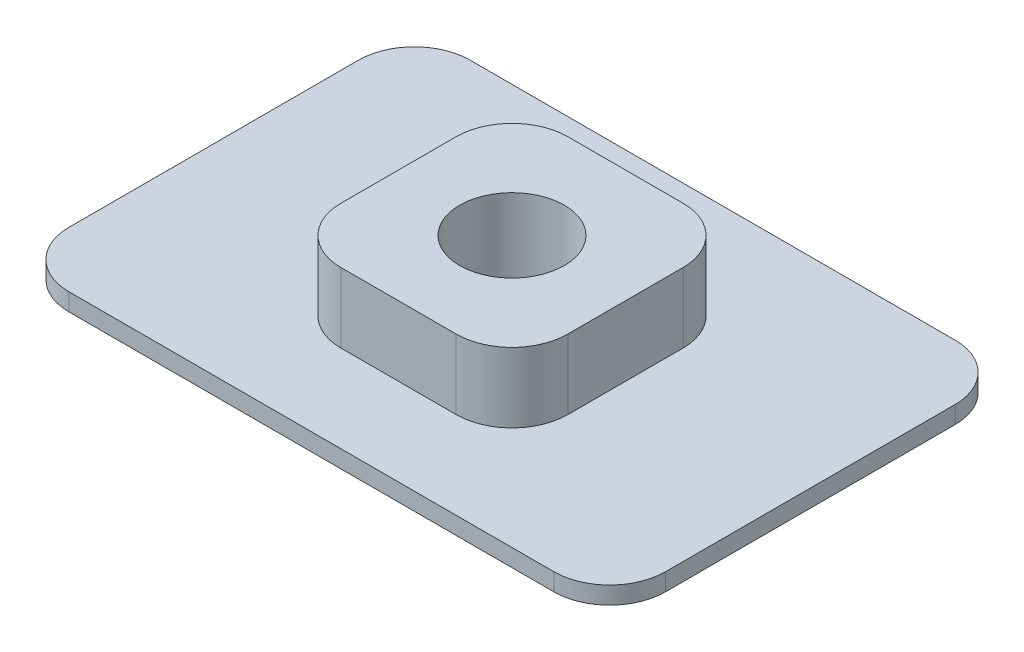
ISO-10303-21;
HEADER;
FILE_DESCRIPTION(('STEP AP214'),'2;1');
FILE_NAME('part.step','',(''),(''),'','','');
FILE_SCHEMA(('AUTOMOTIVE_DESIGN { 1 0 10303 214 1 1 1 1 }'));
ENDSEC;
DATA;
#1=APPLICATION_CONTEXT('core data for automotive mechanical design processes');
#2=APPLICATION_PROTOCOL_DEFINITION('international standard','automotive_design',2000,#1);
#3=PRODUCT_CONTEXT('',#1,'mechanical');
#4=PRODUCT('Part','Part','',(#3));
#5=PRODUCT_RELATED_PRODUCT_CATEGORY('part','',(#4));
#6=PRODUCT_DEFINITION_FORMATION('','',#4);
#7=PRODUCT_DEFINITION_CONTEXT('part definition',#1,'design');
#8=PRODUCT_DEFINITION('design','',#6,#7);
#9=PRODUCT_DEFINITION_SHAPE('','',#8);
#10=(LENGTH_UNIT() NAMED_UNIT(*) SI_UNIT(.MILLI.,.METRE.));
#11=(NAMED_UNIT(*) PLANE_ANGLE_UNIT() SI_UNIT($,.RADIAN.));
#12=(NAMED_UNIT(*) SI_UNIT($,.STERADIAN.) SOLID_ANGLE_UNIT());
#13=UNCERTAINTY_MEASURE_WITH_UNIT(LENGTH_MEASURE(1.E-05),#10,'distance_accuracy_value','');
#14=(GEOMETRIC_REPRESENTATION_CONTEXT(3) GLOBAL_UNCERTAINTY_ASSIGNED_CONTEXT((#13)) GLOBAL_UNIT_ASSIGNED_CONTEXT((#10,
#11,#12)) REPRESENTATION_CONTEXT('',''));
#15=CARTESIAN_POINT('',(0.,0.,0.));
#16=DIRECTION('',(0.,0.,1.));
#17=DIRECTION('',(1.,0.,0.));
#18=AXIS2_PLACEMENT_3D('',#15,#16,#17);
#19=CARTESIAN_POINT('',(0.,2.5,0.));
#20=DIRECTION('',(0.,-1.,0.));
#21=DIRECTION('',(0.,0.,-1.));
#22=AXIS2_PLACEMENT_3D('',#19,#20,#21);
#23=PLANE('',#22);
#24=DIRECTION('',(-1.,0.,0.));
#25=VECTOR('',#24,1.);
#26=CARTESIAN_POINT('',(-42.75,2.5,-28.75));
#27=LINE('',#26,#25);
#28=CARTESIAN_POINT('',(34.75,2.5,-28.75));
#29=VERTEX_POINT('',#28);
#30=CARTESIAN_POINT('',(-34.75,2.5,-28.75));
#31=VERTEX_POINT('',#30);
#32=EDGE_CURVE('E284',#29,#31,#27,.T.);
#33=ORIENTED_EDGE('',*,*,#32,.T.);
#34=CARTESIAN_POINT('',(-34.75,2.5,-20.75));
#35=DIRECTION('',(0.,-1.,0.));
#36=DIRECTION('',(0.,0.,-1.));
#37=AXIS2_PLACEMENT_3D('',#34,#35,#36);
#38=CIRCLE('',#37,8.);
#39=CARTESIAN_POINT('',(-42.75,2.5,-20.75));
#40=VERTEX_POINT('',#39);
#41=EDGE_CURVE('E217',#31,#40,#38,.F.);
#42=ORIENTED_EDGE('',*,*,#41,.T.);
#43=DIRECTION('',(0.,0.,1.));
#44=VECTOR('',#43,1.);
#45=CARTESIAN_POINT('',(-42.75,2.5,28.75));
#46=LINE('',#45,#44);
#47=CARTESIAN_POINT('',(-42.75,2.5,20.75));
#48=VERTEX_POINT('',#47);
#49=EDGE_CURVE('E173',#40,#48,#46,.T.);
#50=ORIENTED_EDGE('',*,*,#49,.T.);
#51=CARTESIAN_POINT('',(-34.75,2.5,20.75));
#52=DIRECTION('',(0.,-1.,0.));
#53=DIRECTION('',(0.,0.,-1.));
#54=AXIS2_PLACEMENT_3D('',#51,#52,#53);
#55=CIRCLE('',#54,8.);
#56=CARTESIAN_POINT('',(-34.75,2.5,28.75));
#57=VERTEX_POINT('',#56);
#58=EDGE_CURVE('E208',#48,#57,#55,.F.);
#59=ORIENTED_EDGE('',*,*,#58,.T.);
#60=DIRECTION('',(1.,0.,0.));
#61=VECTOR('',#60,1.);
#62=CARTESIAN_POINT('',(-42.75,2.5,28.75));
#63=LINE('',#62,#61);
#64=CARTESIAN_POINT('',(34.75,2.5,28.75));
#65=VERTEX_POINT('',#64);
#66=EDGE_CURVE('E194',#57,#65,#63,.T.);
#67=ORIENTED_EDGE('',*,*,#66,.T.);
#68=CARTESIAN_POINT('',(34.75,2.5,20.75));
#69=DIRECTION('',(0.,-1.,0.));
#70=DIRECTION('',(0.,0.,-1.));
#71=AXIS2_PLACEMENT_3D('',#68,#69,#70);
#72=CIRCLE('',#71,8.);
#73=CARTESIAN_POINT('',(42.75,2.5,20.75));
#74=VERTEX_POINT('',#73);
#75=EDGE_CURVE('E211',#65,#74,#72,.F.);
#76=ORIENTED_EDGE('',*,*,#75,.T.);
#77=DIRECTION('',(0.,0.,-1.));
#78=VECTOR('',#77,1.);
#79=CARTESIAN_POINT('',(42.75,2.5,28.75));
#80=LINE('',#79,#78);
#81=CARTESIAN_POINT('',(42.75,2.5,-20.75));
#82=VERTEX_POINT('',#81);
#83=EDGE_CURVE('E187',#74,#82,#80,.T.);
#84=ORIENTED_EDGE('',*,*,#83,.T.);
#85=CARTESIAN_POINT('',(34.75,2.5,-20.75));
#86=DIRECTION('',(0.,-1.,0.));
#87=DIRECTION('',(0.,0.,-1.));
#88=AXIS2_PLACEMENT_3D('',#85,#86,#87);
#89=CIRCLE('',#88,8.);
#90=EDGE_CURVE('E214',#82,#29,#89,.F.);
#91=ORIENTED_EDGE('',*,*,#90,.T.);
#92=EDGE_LOOP('',(#33,#42,#50,#59,#67,#76,#84,#91));
#93=FACE_BOUND('',#92,.T.);
#94=DIRECTION('',(0.,0.,-1.));
#95=VECTOR('',#94,1.);
#96=CARTESIAN_POINT('',(16.25,2.5,16.25));
#97=LINE('',#96,#95);
#98=CARTESIAN_POINT('',(16.25,2.5,8.25));
#99=VERTEX_POINT('',#98);
#100=CARTESIAN_POINT('',(16.25,2.5,-8.25));
#101=VERTEX_POINT('',#100);
#102=EDGE_CURVE('E316',#99,#101,#97,.T.);
#103=ORIENTED_EDGE('',*,*,#102,.F.);
#104=CARTESIAN_POINT('',(8.24999999999999,2.5,8.25));
#105=DIRECTION('',(0.,-1.,0.));
#106=DIRECTION('',(0.,0.,-1.));
#107=AXIS2_PLACEMENT_3D('',#104,#105,#106);
#108=CIRCLE('',#107,8.);
#109=CARTESIAN_POINT('',(8.24999999999999,2.5,16.25));
#110=VERTEX_POINT('',#109);
#111=EDGE_CURVE('E48',#99,#110,#108,.T.);
#112=ORIENTED_EDGE('',*,*,#111,.T.);
#113=DIRECTION('',(1.,0.,0.));
#114=VECTOR('',#113,1.);
#115=CARTESIAN_POINT('',(-16.25,2.5,16.25));
#116=LINE('',#115,#114);
#117=CARTESIAN_POINT('',(-8.25000000000001,2.5,16.25));
#118=VERTEX_POINT('',#117);
#119=EDGE_CURVE('E295',#118,#110,#116,.T.);
#120=ORIENTED_EDGE('',*,*,#119,.F.);
#121=CARTESIAN_POINT('',(-8.25000000000001,2.5,8.25));
#122=DIRECTION('',(0.,-1.,0.));
#123=DIRECTION('',(0.,0.,-1.));
#124=AXIS2_PLACEMENT_3D('',#121,#122,#123);
#125=CIRCLE('',#124,8.);
#126=CARTESIAN_POINT('',(-16.25,2.5,8.25));
#127=VERTEX_POINT('',#126);
#128=EDGE_CURVE('E11',#118,#127,#125,.T.);
#129=ORIENTED_EDGE('',*,*,#128,.T.);
#130=DIRECTION('',(0.,0.,1.));
#131=VECTOR('',#130,1.);
#132=CARTESIAN_POINT('',(-16.25,2.5,16.25));
#133=LINE('',#132,#131);
#134=CARTESIAN_POINT('',(-16.25,2.5,-8.25));
#135=VERTEX_POINT('',#134);
#136=EDGE_CURVE('E324',#135,#127,#133,.T.);
#137=ORIENTED_EDGE('',*,*,#136,.F.);
#138=CARTESIAN_POINT('',(-8.25000000000001,2.5,-8.25));
#139=DIRECTION('',(0.,-1.,0.));
#140=DIRECTION('',(0.,0.,-1.));
#141=AXIS2_PLACEMENT_3D('',#138,#139,#140);
#142=CIRCLE('',#141,8.);
#143=CARTESIAN_POINT('',(-8.25000000000001,2.5,-16.25));
#144=VERTEX_POINT('',#143);
#145=EDGE_CURVE('E273',#135,#144,#142,.T.);
#146=ORIENTED_EDGE('',*,*,#145,.T.);
#147=DIRECTION('',(-1.,0.,0.));
#148=VECTOR('',#147,1.);
#149=CARTESIAN_POINT('',(-16.25,2.5,-16.25));
#150=LINE('',#149,#148);
#151=CARTESIAN_POINT('',(8.24999999999999,2.5,-16.25));
#152=VERTEX_POINT('',#151);
#153=EDGE_CURVE('E320',#152,#144,#150,.T.);
#154=ORIENTED_EDGE('',*,*,#153,.F.);
#155=CARTESIAN_POINT('',(8.24999999999999,2.5,-8.25));
#156=DIRECTION('',(0.,-1.,0.));
#157=DIRECTION('',(0.,0.,-1.));
#158=AXIS2_PLACEMENT_3D('',#155,#156,#157);
#159=CIRCLE('',#158,8.);
#160=EDGE_CURVE('E276',#152,#101,#159,.T.);
#161=ORIENTED_EDGE('',*,*,#160,.T.);
#162=EDGE_LOOP('',(#103,#112,#120,#129,#137,#146,#154,#161));
#163=FACE_BOUND('',#162,.T.);
#164=ADVANCED_FACE('F39',(#93,#163),#23,.F.);
#165=CARTESIAN_POINT('',(42.75,2.5,28.75));
#166=DIRECTION('',(-1.,0.,0.));
#167=DIRECTION('',(0.,0.,1.));
#168=AXIS2_PLACEMENT_3D('',#165,#166,#167);
#169=PLANE('',#168);
#170=DIRECTION('',(0.,0.,-1.));
#171=VECTOR('',#170,1.);
#172=CARTESIAN_POINT('',(42.75,0.,28.75));
#173=LINE('',#172,#171);
#174=CARTESIAN_POINT('',(42.75,0.,20.75));
#175=VERTEX_POINT('',#174);
#176=CARTESIAN_POINT('',(42.75,0.,-20.75));
#177=VERTEX_POINT('',#176);
#178=EDGE_CURVE('E189',#175,#177,#173,.T.);
#179=ORIENTED_EDGE('',*,*,#178,.T.);
#180=DIRECTION('',(0.,-1.,0.));
#181=VECTOR('',#180,1.);
#182=CARTESIAN_POINT('',(42.75,2.5,-20.75));
#183=LINE('',#182,#181);
#184=EDGE_CURVE('E224',#177,#82,#183,.F.);
#185=ORIENTED_EDGE('',*,*,#184,.T.);
#186=ORIENTED_EDGE('',*,*,#83,.F.);
#187=DIRECTION('',(0.,-1.,0.));
#188=VECTOR('',#187,1.);
#189=CARTESIAN_POINT('',(42.75,2.5,20.75));
#190=LINE('',#189,#188);
#191=EDGE_CURVE('E220',#74,#175,#190,.T.);
#192=ORIENTED_EDGE('',*,*,#191,.T.);
#193=EDGE_LOOP('',(#179,#185,#186,#192));
#194=FACE_BOUND('',#193,.T.);
#195=ADVANCED_FACE('F386',(#194),#169,.F.);
#196=CARTESIAN_POINT('',(-42.75,2.5,-28.75));
#197=DIRECTION('',(0.,0.,1.));
#198=DIRECTION('',(1.,0.,0.));
#199=AXIS2_PLACEMENT_3D('',#196,#197,#198);
#200=PLANE('',#199);
#201=DIRECTION('',(-1.,0.,0.));
#202=VECTOR('',#201,1.);
#203=CARTESIAN_POINT('',(-42.75,0.,-28.75));
#204=LINE('',#203,#202);
#205=CARTESIAN_POINT('',(34.75,0.,-28.75));
#206=VERTEX_POINT('',#205);
#207=CARTESIAN_POINT('',(-34.75,0.,-28.75));
#208=VERTEX_POINT('',#207);
#209=EDGE_CURVE('E182',#206,#208,#204,.T.);
#210=ORIENTED_EDGE('',*,*,#209,.T.);
#211=DIRECTION('',(0.,-1.,0.));
#212=VECTOR('',#211,1.);
#213=CARTESIAN_POINT('',(-34.75,2.5,-28.75));
#214=LINE('',#213,#212);
#215=EDGE_CURVE('E157',#208,#31,#214,.F.);
#216=ORIENTED_EDGE('',*,*,#215,.T.);
#217=ORIENTED_EDGE('',*,*,#32,.F.);
#218=DIRECTION('',(0.,-1.,0.));
#219=VECTOR('',#218,1.);
#220=CARTESIAN_POINT('',(34.75,2.5,-28.75));
#221=LINE('',#220,#219);
#222=EDGE_CURVE('E163',#29,#206,#221,.T.);
#223=ORIENTED_EDGE('',*,*,#222,.T.);
#224=EDGE_LOOP('',(#210,#216,#217,#223));
#225=FACE_BOUND('',#224,.T.);
#226=ADVANCED_FACE('F391',(#225),#200,.F.);
#227=CARTESIAN_POINT('',(-42.75,2.5,28.75));
#228=DIRECTION('',(1.,0.,0.));
#229=DIRECTION('',(0.,0.,-1.));
#230=AXIS2_PLACEMENT_3D('',#227,#228,#229);
#231=PLANE('',#230);
#232=ORIENTED_EDGE('',*,*,#49,.F.);
#233=DIRECTION('',(0.,-1.,0.));
#234=VECTOR('',#233,1.);
#235=CARTESIAN_POINT('',(-42.75,2.5,-20.75));
#236=LINE('',#235,#234);
#237=CARTESIAN_POINT('',(-42.75,0.,-20.75));
#238=VERTEX_POINT('',#237);
#239=EDGE_CURVE('E156',#40,#238,#236,.T.);
#240=ORIENTED_EDGE('',*,*,#239,.T.);
#241=DIRECTION('',(0.,0.,1.));
#242=VECTOR('',#241,1.);
#243=CARTESIAN_POINT('',(-42.75,0.,28.75));
#244=LINE('',#243,#242);
#245=CARTESIAN_POINT('',(-42.75,0.,20.75));
#246=VERTEX_POINT('',#245);
#247=EDGE_CURVE('E170',#238,#246,#244,.T.);
#248=ORIENTED_EDGE('',*,*,#247,.T.);
#249=DIRECTION('',(0.,-1.,0.));
#250=VECTOR('',#249,1.);
#251=CARTESIAN_POINT('',(-42.75,2.5,20.75));
#252=LINE('',#251,#250);
#253=EDGE_CURVE('E176',#246,#48,#252,.F.);
#254=ORIENTED_EDGE('',*,*,#253,.T.);
#255=EDGE_LOOP('',(#232,#240,#248,#254));
#256=FACE_BOUND('',#255,.T.);
#257=ADVANCED_FACE('F169',(#256),#231,.F.);
#258=CARTESIAN_POINT('',(-42.75,2.5,28.75));
#259=DIRECTION('',(0.,0.,-1.));
#260=DIRECTION('',(-1.,0.,0.));
#261=AXIS2_PLACEMENT_3D('',#258,#259,#260);
#262=PLANE('',#261);
#263=DIRECTION('',(1.,0.,0.));
#264=VECTOR('',#263,1.);
#265=CARTESIAN_POINT('',(-42.75,0.,28.75));
#266=LINE('',#265,#264);
#267=CARTESIAN_POINT('',(-34.75,0.,28.75));
#268=VERTEX_POINT('',#267);
#269=CARTESIAN_POINT('',(34.75,0.,28.75));
#270=VERTEX_POINT('',#269);
#271=EDGE_CURVE('E181',#268,#270,#266,.T.);
#272=ORIENTED_EDGE('',*,*,#271,.T.);
#273=DIRECTION('',(0.,-1.,0.));
#274=VECTOR('',#273,1.);
#275=CARTESIAN_POINT('',(34.75,2.5,28.75));
#276=LINE('',#275,#274);
#277=EDGE_CURVE('E231',#270,#65,#276,.F.);
#278=ORIENTED_EDGE('',*,*,#277,.T.);
#279=ORIENTED_EDGE('',*,*,#66,.F.);
#280=DIRECTION('',(0.,-1.,0.));
#281=VECTOR('',#280,1.);
#282=CARTESIAN_POINT('',(-34.75,2.5,28.75));
#283=LINE('',#282,#281);
#284=EDGE_CURVE('E227',#57,#268,#283,.T.);
#285=ORIENTED_EDGE('',*,*,#284,.T.);
#286=EDGE_LOOP('',(#272,#278,#279,#285));
#287=FACE_BOUND('',#286,.T.);
#288=ADVANCED_FACE('F398',(#287),#262,.F.);
#289=CARTESIAN_POINT('',(0.,0.,0.));
#290=DIRECTION('',(0.,-1.,0.));
#291=DIRECTION('',(0.,0.,-1.));
#292=AXIS2_PLACEMENT_3D('',#289,#290,#291);
#293=PLANE('',#292);
#294=CARTESIAN_POINT('',(0.,0.,0.));
#295=DIRECTION('',(0.,1.,0.));
#296=DIRECTION('',(0.,0.,1.));
#297=AXIS2_PLACEMENT_3D('',#294,#295,#296);
#298=CIRCLE('',#297,7.5);
#299=CARTESIAN_POINT('',(0.,0.,7.5));
#300=VERTEX_POINT('',#299);
#301=EDGE_CURVE('E321',#300,#300,#298,.T.);
#302=ORIENTED_EDGE('',*,*,#301,.T.);
#303=EDGE_LOOP('',(#302));
#304=FACE_BOUND('',#303,.T.);
#305=ORIENTED_EDGE('',*,*,#247,.F.);
#306=CARTESIAN_POINT('',(-34.75,0.,-20.75));
#307=DIRECTION('',(0.,-1.,0.));
#308=DIRECTION('',(0.,0.,-1.));
#309=AXIS2_PLACEMENT_3D('',#306,#307,#308);
#310=CIRCLE('',#309,8.);
#311=EDGE_CURVE('E152',#238,#208,#310,.T.);
#312=ORIENTED_EDGE('',*,*,#311,.T.);
#313=ORIENTED_EDGE('',*,*,#209,.F.);
#314=CARTESIAN_POINT('',(34.75,0.,-20.75));
#315=DIRECTION('',(0.,-1.,0.));
#316=DIRECTION('',(0.,0.,-1.));
#317=AXIS2_PLACEMENT_3D('',#314,#315,#316);
#318=CIRCLE('',#317,8.);
#319=EDGE_CURVE('E164',#206,#177,#318,.T.);
#320=ORIENTED_EDGE('',*,*,#319,.T.);
#321=ORIENTED_EDGE('',*,*,#178,.F.);
#322=CARTESIAN_POINT('',(34.75,0.,20.75));
#323=DIRECTION('',(0.,-1.,0.));
#324=DIRECTION('',(0.,0.,-1.));
#325=AXIS2_PLACEMENT_3D('',#322,#323,#324);
#326=CIRCLE('',#325,8.);
#327=EDGE_CURVE('E198',#175,#270,#326,.T.);
#328=ORIENTED_EDGE('',*,*,#327,.T.);
#329=ORIENTED_EDGE('',*,*,#271,.F.);
#330=CARTESIAN_POINT('',(-34.75,0.,20.75));
#331=DIRECTION('',(0.,-1.,0.));
#332=DIRECTION('',(0.,0.,-1.));
#333=AXIS2_PLACEMENT_3D('',#330,#331,#332);
#334=CIRCLE('',#333,8.);
#335=EDGE_CURVE('E175',#268,#246,#334,.T.);
#336=ORIENTED_EDGE('',*,*,#335,.T.);
#337=EDGE_LOOP('',(#305,#312,#313,#320,#321,#328,#329,#336));
#338=FACE_BOUND('',#337,.T.);
#339=ADVANCED_FACE('F178',(#304,#338),#293,.T.);
#340=CARTESIAN_POINT('',(-34.75,2.5,-20.75));
#341=DIRECTION('',(0.,-1.,0.));
#342=DIRECTION('',(0.,0.,-1.));
#343=AXIS2_PLACEMENT_3D('',#340,#341,#342);
#344=CYLINDRICAL_SURFACE('',#343,8.);
#345=ORIENTED_EDGE('',*,*,#41,.F.);
#346=ORIENTED_EDGE('',*,*,#215,.F.);
#347=ORIENTED_EDGE('',*,*,#311,.F.);
#348=ORIENTED_EDGE('',*,*,#239,.F.);
#349=EDGE_LOOP('',(#345,#346,#347,#348));
#350=FACE_BOUND('',#349,.T.);
#351=ADVANCED_FACE('F155',(#350),#344,.T.);
#352=CARTESIAN_POINT('',(34.75,2.5,-20.75));
#353=DIRECTION('',(0.,-1.,0.));
#354=DIRECTION('',(0.,0.,-1.));
#355=AXIS2_PLACEMENT_3D('',#352,#353,#354);
#356=CYLINDRICAL_SURFACE('',#355,8.);
#357=ORIENTED_EDGE('',*,*,#90,.F.);
#358=ORIENTED_EDGE('',*,*,#184,.F.);
#359=ORIENTED_EDGE('',*,*,#319,.F.);
#360=ORIENTED_EDGE('',*,*,#222,.F.);
#361=EDGE_LOOP('',(#357,#358,#359,#360));
#362=FACE_BOUND('',#361,.T.);
#363=ADVANCED_FACE('F409',(#362),#356,.T.);
#364=CARTESIAN_POINT('',(34.75,2.5,20.75));
#365=DIRECTION('',(0.,-1.,0.));
#366=DIRECTION('',(0.,0.,-1.));
#367=AXIS2_PLACEMENT_3D('',#364,#365,#366);
#368=CYLINDRICAL_SURFACE('',#367,8.);
#369=ORIENTED_EDGE('',*,*,#75,.F.);
#370=ORIENTED_EDGE('',*,*,#277,.F.);
#371=ORIENTED_EDGE('',*,*,#327,.F.);
#372=ORIENTED_EDGE('',*,*,#191,.F.);
#373=EDGE_LOOP('',(#369,#370,#371,#372));
#374=FACE_BOUND('',#373,.T.);
#375=ADVANCED_FACE('F412',(#374),#368,.T.);
#376=CARTESIAN_POINT('',(-34.75,2.5,20.75));
#377=DIRECTION('',(0.,-1.,0.));
#378=DIRECTION('',(0.,0.,-1.));
#379=AXIS2_PLACEMENT_3D('',#376,#377,#378);
#380=CYLINDRICAL_SURFACE('',#379,8.);
#381=ORIENTED_EDGE('',*,*,#58,.F.);
#382=ORIENTED_EDGE('',*,*,#253,.F.);
#383=ORIENTED_EDGE('',*,*,#335,.F.);
#384=ORIENTED_EDGE('',*,*,#284,.F.);
#385=EDGE_LOOP('',(#381,#382,#383,#384));
#386=FACE_BOUND('',#385,.T.);
#387=ADVANCED_FACE('F416',(#386),#380,.T.);
#388=CARTESIAN_POINT('',(16.25,12.5,16.25));
#389=DIRECTION('',(-1.,0.,0.));
#390=DIRECTION('',(0.,0.,1.));
#391=AXIS2_PLACEMENT_3D('',#388,#389,#390);
#392=PLANE('',#391);
#393=ORIENTED_EDGE('',*,*,#102,.T.);
#394=DIRECTION('',(0.,-1.,0.));
#395=VECTOR('',#394,1.);
#396=CARTESIAN_POINT('',(16.25,12.5,-8.25));
#397=LINE('',#396,#395);
#398=CARTESIAN_POINT('',(16.25,12.5,-8.25));
#399=VERTEX_POINT('',#398);
#400=EDGE_CURVE('E264',#101,#399,#397,.F.);
#401=ORIENTED_EDGE('',*,*,#400,.T.);
#402=DIRECTION('',(0.,0.,-1.));
#403=VECTOR('',#402,1.);
#404=CARTESIAN_POINT('',(16.25,12.5,16.25));
#405=LINE('',#404,#403);
#406=CARTESIAN_POINT('',(16.25,12.5,8.25));
#407=VERTEX_POINT('',#406);
#408=EDGE_CURVE('E330',#407,#399,#405,.T.);
#409=ORIENTED_EDGE('',*,*,#408,.F.);
#410=DIRECTION('',(0.,-1.,0.));
#411=VECTOR('',#410,1.);
#412=CARTESIAN_POINT('',(16.25,12.5,8.25));
#413=LINE('',#412,#411);
#414=EDGE_CURVE('E260',#407,#99,#413,.T.);
#415=ORIENTED_EDGE('',*,*,#414,.T.);
#416=EDGE_LOOP('',(#393,#401,#409,#415));
#417=FACE_BOUND('',#416,.T.);
#418=ADVANCED_FACE('F376',(#417),#392,.F.);
#419=CARTESIAN_POINT('',(-16.25,12.5,-16.25));
#420=DIRECTION('',(0.,0.,1.));
#421=DIRECTION('',(1.,0.,0.));
#422=AXIS2_PLACEMENT_3D('',#419,#420,#421);
#423=PLANE('',#422);
#424=ORIENTED_EDGE('',*,*,#153,.T.);
#425=DIRECTION('',(0.,-1.,0.));
#426=VECTOR('',#425,1.);
#427=CARTESIAN_POINT('',(-8.25000000000001,12.5,-16.25));
#428=LINE('',#427,#426);
#429=CARTESIAN_POINT('',(-8.25000000000001,12.5,-16.25));
#430=VERTEX_POINT('',#429);
#431=EDGE_CURVE('E245',#144,#430,#428,.F.);
#432=ORIENTED_EDGE('',*,*,#431,.T.);
#433=DIRECTION('',(-1.,0.,0.));
#434=VECTOR('',#433,1.);
#435=CARTESIAN_POINT('',(-16.25,12.5,-16.25));
#436=LINE('',#435,#434);
#437=CARTESIAN_POINT('',(8.24999999999999,12.5,-16.25));
#438=VERTEX_POINT('',#437);
#439=EDGE_CURVE('E312',#438,#430,#436,.T.);
#440=ORIENTED_EDGE('',*,*,#439,.F.);
#441=DIRECTION('',(0.,-1.,0.));
#442=VECTOR('',#441,1.);
#443=CARTESIAN_POINT('',(8.24999999999999,12.5,-16.25));
#444=LINE('',#443,#442);
#445=EDGE_CURVE('E241',#438,#152,#444,.T.);
#446=ORIENTED_EDGE('',*,*,#445,.T.);
#447=EDGE_LOOP('',(#424,#432,#440,#446));
#448=FACE_BOUND('',#447,.T.);
#449=ADVANCED_FACE('F371',(#448),#423,.F.);
#450=CARTESIAN_POINT('',(-16.25,12.5,16.25));
#451=DIRECTION('',(1.,0.,0.));
#452=DIRECTION('',(0.,0.,-1.));
#453=AXIS2_PLACEMENT_3D('',#450,#451,#452);
#454=PLANE('',#453);
#455=DIRECTION('',(0.,0.,1.));
#456=VECTOR('',#455,1.);
#457=CARTESIAN_POINT('',(-16.25,12.5,16.25));
#458=LINE('',#457,#456);
#459=CARTESIAN_POINT('',(-16.25,12.5,-8.25));
#460=VERTEX_POINT('',#459);
#461=CARTESIAN_POINT('',(-16.25,12.5,8.25));
#462=VERTEX_POINT('',#461);
#463=EDGE_CURVE('E305',#460,#462,#458,.T.);
#464=ORIENTED_EDGE('',*,*,#463,.F.);
#465=DIRECTION('',(0.,-1.,0.));
#466=VECTOR('',#465,1.);
#467=CARTESIAN_POINT('',(-16.25,12.5,-8.25));
#468=LINE('',#467,#466);
#469=EDGE_CURVE('E237',#460,#135,#468,.T.);
#470=ORIENTED_EDGE('',*,*,#469,.T.);
#471=ORIENTED_EDGE('',*,*,#136,.T.);
#472=DIRECTION('',(0.,-1.,0.));
#473=VECTOR('',#472,1.);
#474=CARTESIAN_POINT('',(-16.25,12.5,8.25));
#475=LINE('',#474,#473);
#476=EDGE_CURVE('E234',#127,#462,#475,.F.);
#477=ORIENTED_EDGE('',*,*,#476,.T.);
#478=EDGE_LOOP('',(#464,#470,#471,#477));
#479=FACE_BOUND('',#478,.T.);
#480=ADVANCED_FACE('F369',(#479),#454,.F.);
#481=CARTESIAN_POINT('',(-16.25,12.5,16.25));
#482=DIRECTION('',(0.,0.,-1.));
#483=DIRECTION('',(-1.,0.,0.));
#484=AXIS2_PLACEMENT_3D('',#481,#482,#483);
#485=PLANE('',#484);
#486=ORIENTED_EDGE('',*,*,#119,.T.);
#487=DIRECTION('',(0.,-1.,0.));
#488=VECTOR('',#487,1.);
#489=CARTESIAN_POINT('',(8.24999999999999,12.5,16.25));
#490=LINE('',#489,#488);
#491=CARTESIAN_POINT('',(8.24999999999999,12.5,16.25));
#492=VERTEX_POINT('',#491);
#493=EDGE_CURVE('E270',#110,#492,#490,.F.);
#494=ORIENTED_EDGE('',*,*,#493,.T.);
#495=DIRECTION('',(1.,0.,0.));
#496=VECTOR('',#495,1.);
#497=CARTESIAN_POINT('',(-16.25,12.5,16.25));
#498=LINE('',#497,#496);
#499=CARTESIAN_POINT('',(-8.25000000000001,12.5,16.25));
#500=VERTEX_POINT('',#499);
#501=EDGE_CURVE('E299',#500,#492,#498,.T.);
#502=ORIENTED_EDGE('',*,*,#501,.F.);
#503=DIRECTION('',(0.,-1.,0.));
#504=VECTOR('',#503,1.);
#505=CARTESIAN_POINT('',(-8.25000000000001,12.5,16.25));
#506=LINE('',#505,#504);
#507=EDGE_CURVE('E267',#500,#118,#506,.T.);
#508=ORIENTED_EDGE('',*,*,#507,.T.);
#509=EDGE_LOOP('',(#486,#494,#502,#508));
#510=FACE_BOUND('',#509,.T.);
#511=ADVANCED_FACE('F359',(#510),#485,.F.);
#512=CARTESIAN_POINT('',(0.,12.5,0.));
#513=DIRECTION('',(0.,-1.,0.));
#514=DIRECTION('',(0.,0.,-1.));
#515=AXIS2_PLACEMENT_3D('',#512,#513,#514);
#516=PLANE('',#515);
#517=CARTESIAN_POINT('',(0.,12.5,0.));
#518=DIRECTION('',(0.,1.,0.));
#519=DIRECTION('',(0.,0.,1.));
#520=AXIS2_PLACEMENT_3D('',#517,#518,#519);
#521=CIRCLE('',#520,7.5);
#522=CARTESIAN_POINT('',(0.,12.5,7.5));
#523=VERTEX_POINT('',#522);
#524=EDGE_CURVE('E341',#523,#523,#521,.T.);
#525=ORIENTED_EDGE('',*,*,#524,.F.);
#526=EDGE_LOOP('',(#525));
#527=FACE_BOUND('',#526,.T.);
#528=ORIENTED_EDGE('',*,*,#439,.T.);
#529=CARTESIAN_POINT('',(-8.25000000000001,12.5,-8.25));
#530=DIRECTION('',(0.,-1.,0.));
#531=DIRECTION('',(0.,0.,-1.));
#532=AXIS2_PLACEMENT_3D('',#529,#530,#531);
#533=CIRCLE('',#532,8.);
#534=EDGE_CURVE('E257',#430,#460,#533,.F.);
#535=ORIENTED_EDGE('',*,*,#534,.T.);
#536=ORIENTED_EDGE('',*,*,#463,.T.);
#537=CARTESIAN_POINT('',(-8.25000000000001,12.5,8.25));
#538=DIRECTION('',(0.,-1.,0.));
#539=DIRECTION('',(0.,0.,-1.));
#540=AXIS2_PLACEMENT_3D('',#537,#538,#539);
#541=CIRCLE('',#540,8.);
#542=EDGE_CURVE('E248',#462,#500,#541,.F.);
#543=ORIENTED_EDGE('',*,*,#542,.T.);
#544=ORIENTED_EDGE('',*,*,#501,.T.);
#545=CARTESIAN_POINT('',(8.24999999999999,12.5,8.25));
#546=DIRECTION('',(0.,-1.,0.));
#547=DIRECTION('',(0.,0.,-1.));
#548=AXIS2_PLACEMENT_3D('',#545,#546,#547);
#549=CIRCLE('',#548,8.);
#550=EDGE_CURVE('E251',#492,#407,#549,.F.);
#551=ORIENTED_EDGE('',*,*,#550,.T.);
#552=ORIENTED_EDGE('',*,*,#408,.T.);
#553=CARTESIAN_POINT('',(8.24999999999999,12.5,-8.25));
#554=DIRECTION('',(0.,-1.,0.));
#555=DIRECTION('',(0.,0.,-1.));
#556=AXIS2_PLACEMENT_3D('',#553,#554,#555);
#557=CIRCLE('',#556,8.);
#558=EDGE_CURVE('E254',#399,#438,#557,.F.);
#559=ORIENTED_EDGE('',*,*,#558,.T.);
#560=EDGE_LOOP('',(#528,#535,#536,#543,#544,#551,#552,#559));
#561=FACE_BOUND('',#560,.T.);
#562=ADVANCED_FACE('F356',(#527,#561),#516,.F.);
#563=CARTESIAN_POINT('',(-8.25000000000001,12.5,-8.25));
#564=DIRECTION('',(0.,-1.,0.));
#565=DIRECTION('',(0.,0.,-1.));
#566=AXIS2_PLACEMENT_3D('',#563,#564,#565);
#567=CYLINDRICAL_SURFACE('',#566,8.);
#568=ORIENTED_EDGE('',*,*,#534,.F.);
#569=ORIENTED_EDGE('',*,*,#431,.F.);
#570=ORIENTED_EDGE('',*,*,#145,.F.);
#571=ORIENTED_EDGE('',*,*,#469,.F.);
#572=EDGE_LOOP('',(#568,#569,#570,#571));
#573=FACE_BOUND('',#572,.T.);
#574=ADVANCED_FACE('F358',(#573),#567,.T.);
#575=CARTESIAN_POINT('',(8.24999999999999,12.5,-8.25));
#576=DIRECTION('',(0.,-1.,0.));
#577=DIRECTION('',(0.,0.,-1.));
#578=AXIS2_PLACEMENT_3D('',#575,#576,#577);
#579=CYLINDRICAL_SURFACE('',#578,8.);
#580=ORIENTED_EDGE('',*,*,#558,.F.);
#581=ORIENTED_EDGE('',*,*,#400,.F.);
#582=ORIENTED_EDGE('',*,*,#160,.F.);
#583=ORIENTED_EDGE('',*,*,#445,.F.);
#584=EDGE_LOOP('',(#580,#581,#582,#583));
#585=FACE_BOUND('',#584,.T.);
#586=ADVANCED_FACE('F373',(#585),#579,.T.);
#587=CARTESIAN_POINT('',(8.24999999999999,12.5,8.25));
#588=DIRECTION('',(0.,-1.,0.));
#589=DIRECTION('',(0.,0.,-1.));
#590=AXIS2_PLACEMENT_3D('',#587,#588,#589);
#591=CYLINDRICAL_SURFACE('',#590,8.);
#592=ORIENTED_EDGE('',*,*,#550,.F.);
#593=ORIENTED_EDGE('',*,*,#493,.F.);
#594=ORIENTED_EDGE('',*,*,#111,.F.);
#595=ORIENTED_EDGE('',*,*,#414,.F.);
#596=EDGE_LOOP('',(#592,#593,#594,#595));
#597=FACE_BOUND('',#596,.T.);
#598=ADVANCED_FACE('F379',(#597),#591,.T.);
#599=CARTESIAN_POINT('',(-8.25000000000001,12.5,8.25));
#600=DIRECTION('',(0.,-1.,0.));
#601=DIRECTION('',(0.,0.,-1.));
#602=AXIS2_PLACEMENT_3D('',#599,#600,#601);
#603=CYLINDRICAL_SURFACE('',#602,8.);
#604=ORIENTED_EDGE('',*,*,#542,.F.);
#605=ORIENTED_EDGE('',*,*,#476,.F.);
#606=ORIENTED_EDGE('',*,*,#128,.F.);
#607=ORIENTED_EDGE('',*,*,#507,.F.);
#608=EDGE_LOOP('',(#604,#605,#606,#607));
#609=FACE_BOUND('',#608,.T.);
#610=ADVANCED_FACE('F41',(#609),#603,.T.);
#611=CARTESIAN_POINT('',(0.,0.,0.));
#612=DIRECTION('',(0.,1.,0.));
#613=DIRECTION('',(0.,0.,1.));
#614=AXIS2_PLACEMENT_3D('',#611,#612,#613);
#615=CYLINDRICAL_SURFACE('',#614,7.5);
#616=ORIENTED_EDGE('',*,*,#301,.F.);
#617=EDGE_LOOP('',(#616));
#618=FACE_BOUND('',#617,.T.);
#619=ORIENTED_EDGE('',*,*,#524,.T.);
#620=EDGE_LOOP('',(#619));
#621=FACE_BOUND('',#620,.T.);
#622=ADVANCED_FACE('F350',(#618,#621),#615,.F.);
#623=CLOSED_SHELL('',(#164,#195,#226,#257,#288,#339,#351,#363,#375,#387,#418,#449,#480,#511,
#562,#574,#586,#598,#610,#622));
#624=MANIFOLD_SOLID_BREP('B2',#623);
#625=ADVANCED_BREP_SHAPE_REPRESENTATION('',(#18,#624),#14);
#626=SHAPE_DEFINITION_REPRESENTATION(#9,#625);
ENDSEC;
END-ISO-10303-21;
